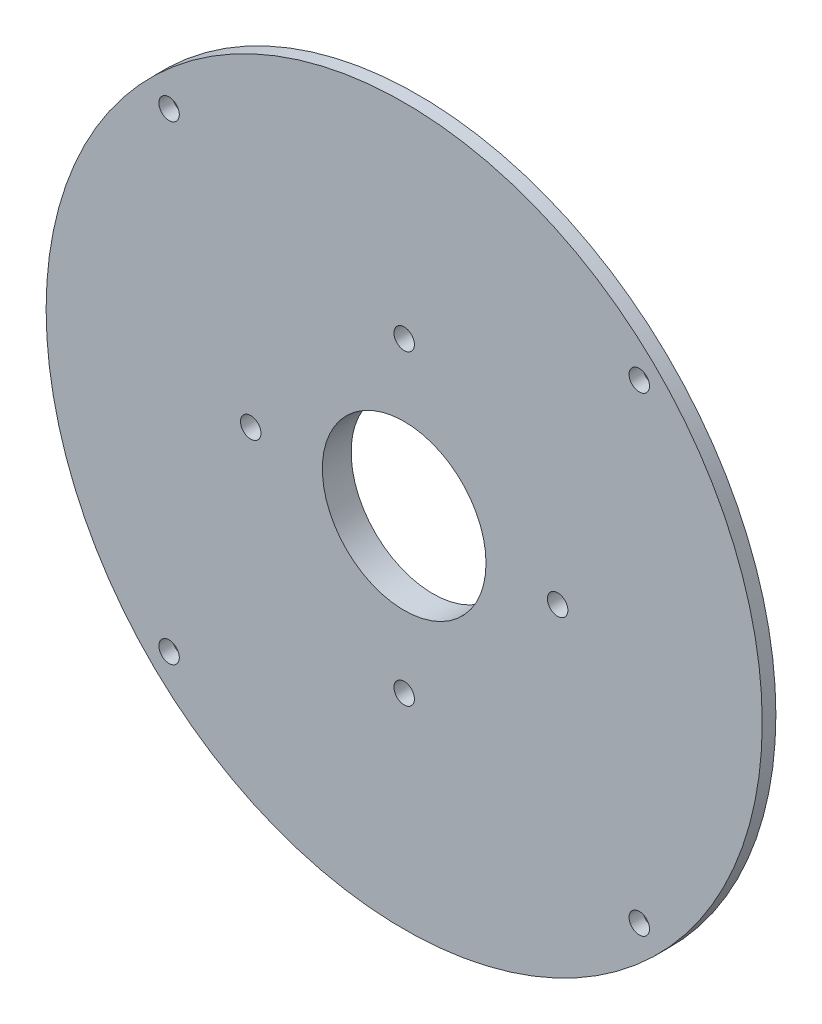
ISO-10303-21;
HEADER;
FILE_DESCRIPTION(('STEP AP214'),'2;1');
FILE_NAME('part.step','',(''),(''),'','','');
FILE_SCHEMA(('AUTOMOTIVE_DESIGN { 1 0 10303 214 1 1 1 1 }'));
ENDSEC;
DATA;
#1=APPLICATION_CONTEXT('core data for automotive mechanical design processes');
#2=APPLICATION_PROTOCOL_DEFINITION('international standard','automotive_design',2000,#1);
#3=PRODUCT_CONTEXT('',#1,'mechanical');
#4=PRODUCT('Part','Part','',(#3));
#5=PRODUCT_RELATED_PRODUCT_CATEGORY('part','',(#4));
#6=PRODUCT_DEFINITION_FORMATION('','',#4);
#7=PRODUCT_DEFINITION_CONTEXT('part definition',#1,'design');
#8=PRODUCT_DEFINITION('design','',#6,#7);
#9=PRODUCT_DEFINITION_SHAPE('','',#8);
#10=(LENGTH_UNIT() NAMED_UNIT(*) SI_UNIT(.MILLI.,.METRE.));
#11=(NAMED_UNIT(*) PLANE_ANGLE_UNIT() SI_UNIT($,.RADIAN.));
#12=(NAMED_UNIT(*) SI_UNIT($,.STERADIAN.) SOLID_ANGLE_UNIT());
#13=UNCERTAINTY_MEASURE_WITH_UNIT(LENGTH_MEASURE(1.E-05),#10,'distance_accuracy_value','');
#14=(GEOMETRIC_REPRESENTATION_CONTEXT(3) GLOBAL_UNCERTAINTY_ASSIGNED_CONTEXT((#13)) GLOBAL_UNIT_ASSIGNED_CONTEXT((#10,
#11,#12)) REPRESENTATION_CONTEXT('',''));
#15=CARTESIAN_POINT('',(0.,0.,0.));
#16=DIRECTION('',(0.,0.,1.));
#17=DIRECTION('',(1.,0.,0.));
#18=AXIS2_PLACEMENT_3D('',#15,#16,#17);
#19=CARTESIAN_POINT('',(0.,0.,-4.22));
#20=DIRECTION('',(0.,0.,1.));
#21=DIRECTION('',(1.,0.,0.));
#22=AXIS2_PLACEMENT_3D('',#19,#20,#21);
#23=CYLINDRICAL_SURFACE('',#22,30.625);
#24=CARTESIAN_POINT('',(0.,0.,-4.22));
#25=DIRECTION('',(0.,0.,1.));
#26=DIRECTION('',(1.,0.,0.));
#27=AXIS2_PLACEMENT_3D('',#24,#25,#26);
#28=CIRCLE('',#27,30.625);
#29=CARTESIAN_POINT('',(30.625,0.,-4.22));
#30=VERTEX_POINT('',#29);
#31=EDGE_CURVE('E10',#30,#30,#28,.T.);
#32=ORIENTED_EDGE('',*,*,#31,.T.);
#33=EDGE_LOOP('',(#32));
#34=FACE_BOUND('',#33,.T.);
#35=CARTESIAN_POINT('',(0.,0.,-2.));
#36=DIRECTION('',(0.,0.,1.));
#37=DIRECTION('',(1.,0.,0.));
#38=AXIS2_PLACEMENT_3D('',#35,#36,#37);
#39=CIRCLE('',#38,30.625);
#40=CARTESIAN_POINT('',(30.625,0.,-2.));
#41=VERTEX_POINT('',#40);
#42=EDGE_CURVE('E95',#41,#41,#39,.T.);
#43=ORIENTED_EDGE('',*,*,#42,.F.);
#44=EDGE_LOOP('',(#43));
#45=FACE_BOUND('',#44,.T.);
#46=ADVANCED_FACE('F37',(#34,#45),#23,.T.);
#47=CARTESIAN_POINT('',(0.,0.,-4.22));
#48=DIRECTION('',(0.,0.,1.));
#49=DIRECTION('',(1.,0.,0.));
#50=AXIS2_PLACEMENT_3D('',#47,#48,#49);
#51=CYLINDRICAL_SURFACE('',#50,12.);
#52=CARTESIAN_POINT('',(0.,0.,-4.22));
#53=DIRECTION('',(0.,0.,1.));
#54=DIRECTION('',(1.,0.,0.));
#55=AXIS2_PLACEMENT_3D('',#52,#53,#54);
#56=CIRCLE('',#55,12.);
#57=CARTESIAN_POINT('',(12.,0.,-4.22));
#58=VERTEX_POINT('',#57);
#59=EDGE_CURVE('E46',#58,#58,#56,.T.);
#60=ORIENTED_EDGE('',*,*,#59,.F.);
#61=EDGE_LOOP('',(#60));
#62=FACE_BOUND('',#61,.T.);
#63=CARTESIAN_POINT('',(0.,0.,0.));
#64=DIRECTION('',(0.,0.,1.));
#65=DIRECTION('',(1.,0.,0.));
#66=AXIS2_PLACEMENT_3D('',#63,#64,#65);
#67=CIRCLE('',#66,12.);
#68=CARTESIAN_POINT('',(12.,0.,0.));
#69=VERTEX_POINT('',#68);
#70=EDGE_CURVE('E54',#69,#69,#67,.T.);
#71=ORIENTED_EDGE('',*,*,#70,.T.);
#72=EDGE_LOOP('',(#71));
#73=FACE_BOUND('',#72,.T.);
#74=ADVANCED_FACE('F39',(#62,#73),#51,.F.);
#75=CARTESIAN_POINT('',(0.,0.,-4.22));
#76=DIRECTION('',(0.,0.,1.));
#77=DIRECTION('',(1.,0.,0.));
#78=AXIS2_PLACEMENT_3D('',#75,#76,#77);
#79=PLANE('',#78);
#80=CARTESIAN_POINT('',(0.,22.5,-4.22));
#81=DIRECTION('',(0.,0.,1.));
#82=DIRECTION('',(1.,0.,0.));
#83=AXIS2_PLACEMENT_3D('',#80,#81,#82);
#84=CIRCLE('',#83,1.5);
#85=CARTESIAN_POINT('',(1.5,22.5,-4.22));
#86=VERTEX_POINT('',#85);
#87=EDGE_CURVE('E91',#86,#86,#84,.T.);
#88=ORIENTED_EDGE('',*,*,#87,.T.);
#89=EDGE_LOOP('',(#88));
#90=FACE_BOUND('',#89,.T.);
#91=CARTESIAN_POINT('',(22.5,0.,-4.22));
#92=DIRECTION('',(0.,0.,1.));
#93=DIRECTION('',(1.,0.,0.));
#94=AXIS2_PLACEMENT_3D('',#91,#92,#93);
#95=CIRCLE('',#94,1.5);
#96=CARTESIAN_POINT('',(24.,0.,-4.22));
#97=VERTEX_POINT('',#96);
#98=EDGE_CURVE('E84',#97,#97,#95,.T.);
#99=ORIENTED_EDGE('',*,*,#98,.T.);
#100=EDGE_LOOP('',(#99));
#101=FACE_BOUND('',#100,.T.);
#102=CARTESIAN_POINT('',(0.,-22.5,-4.22));
#103=DIRECTION('',(0.,0.,1.));
#104=DIRECTION('',(1.,0.,0.));
#105=AXIS2_PLACEMENT_3D('',#102,#103,#104);
#106=CIRCLE('',#105,1.5);
#107=CARTESIAN_POINT('',(1.5,-22.5,-4.22));
#108=VERTEX_POINT('',#107);
#109=EDGE_CURVE('E78',#108,#108,#106,.T.);
#110=ORIENTED_EDGE('',*,*,#109,.T.);
#111=EDGE_LOOP('',(#110));
#112=FACE_BOUND('',#111,.T.);
#113=CARTESIAN_POINT('',(-22.5,0.,-4.22));
#114=DIRECTION('',(0.,0.,1.));
#115=DIRECTION('',(1.,0.,0.));
#116=AXIS2_PLACEMENT_3D('',#113,#114,#115);
#117=CIRCLE('',#116,1.5);
#118=CARTESIAN_POINT('',(-21.,0.,-4.22));
#119=VERTEX_POINT('',#118);
#120=EDGE_CURVE('E73',#119,#119,#117,.T.);
#121=ORIENTED_EDGE('',*,*,#120,.T.);
#122=EDGE_LOOP('',(#121));
#123=FACE_BOUND('',#122,.T.);
#124=ORIENTED_EDGE('',*,*,#59,.T.);
#125=EDGE_LOOP('',(#124));
#126=FACE_BOUND('',#125,.T.);
#127=ORIENTED_EDGE('',*,*,#31,.F.);
#128=EDGE_LOOP('',(#127));
#129=FACE_BOUND('',#128,.T.);
#130=ADVANCED_FACE('F117',(#90,#101,#112,#123,#126,#129),#79,.F.);
#131=CARTESIAN_POINT('',(0.,0.,0.));
#132=DIRECTION('',(0.,0.,1.));
#133=DIRECTION('',(1.,0.,0.));
#134=AXIS2_PLACEMENT_3D('',#131,#132,#133);
#135=PLANE('',#134);
#136=CARTESIAN_POINT('',(0.,22.5,0.));
#137=DIRECTION('',(0.,0.,1.));
#138=DIRECTION('',(1.,0.,0.));
#139=AXIS2_PLACEMENT_3D('',#136,#137,#138);
#140=CIRCLE('',#139,1.5);
#141=CARTESIAN_POINT('',(1.5,22.5,0.));
#142=VERTEX_POINT('',#141);
#143=EDGE_CURVE('E189',#142,#142,#140,.T.);
#144=ORIENTED_EDGE('',*,*,#143,.F.);
#145=EDGE_LOOP('',(#144));
#146=FACE_BOUND('',#145,.T.);
#147=CARTESIAN_POINT('',(34.4714555828442,34.4714555828442,0.));
#148=DIRECTION('',(0.,0.,1.));
#149=DIRECTION('',(1.,0.,0.));
#150=AXIS2_PLACEMENT_3D('',#147,#148,#149);
#151=CIRCLE('',#150,1.5);
#152=CARTESIAN_POINT('',(35.9714555828442,34.4714555828442,0.));
#153=VERTEX_POINT('',#152);
#154=EDGE_CURVE('E191',#153,#153,#151,.T.);
#155=ORIENTED_EDGE('',*,*,#154,.F.);
#156=EDGE_LOOP('',(#155));
#157=FACE_BOUND('',#156,.T.);
#158=CARTESIAN_POINT('',(34.4714555828442,-34.4714555828442,0.));
#159=DIRECTION('',(0.,0.,1.));
#160=DIRECTION('',(1.,0.,0.));
#161=AXIS2_PLACEMENT_3D('',#158,#159,#160);
#162=CIRCLE('',#161,1.5);
#163=CARTESIAN_POINT('',(35.9714555828442,-34.4714555828442,0.));
#164=VERTEX_POINT('',#163);
#165=EDGE_CURVE('E195',#164,#164,#162,.T.);
#166=ORIENTED_EDGE('',*,*,#165,.F.);
#167=EDGE_LOOP('',(#166));
#168=FACE_BOUND('',#167,.T.);
#169=CARTESIAN_POINT('',(-34.4714555828442,-34.4714555828442,0.));
#170=DIRECTION('',(0.,0.,1.));
#171=DIRECTION('',(1.,0.,0.));
#172=AXIS2_PLACEMENT_3D('',#169,#170,#171);
#173=CIRCLE('',#172,1.50000000000001);
#174=CARTESIAN_POINT('',(-32.9714555828442,-34.4714555828442,0.));
#175=VERTEX_POINT('',#174);
#176=EDGE_CURVE('E202',#175,#175,#173,.T.);
#177=ORIENTED_EDGE('',*,*,#176,.F.);
#178=EDGE_LOOP('',(#177));
#179=FACE_BOUND('',#178,.T.);
#180=CARTESIAN_POINT('',(22.5,0.,0.));
#181=DIRECTION('',(0.,0.,1.));
#182=DIRECTION('',(1.,0.,0.));
#183=AXIS2_PLACEMENT_3D('',#180,#181,#182);
#184=CIRCLE('',#183,1.5);
#185=CARTESIAN_POINT('',(24.,0.,0.));
#186=VERTEX_POINT('',#185);
#187=EDGE_CURVE('E204',#186,#186,#184,.T.);
#188=ORIENTED_EDGE('',*,*,#187,.F.);
#189=EDGE_LOOP('',(#188));
#190=FACE_BOUND('',#189,.T.);
#191=CARTESIAN_POINT('',(0.,-22.5,0.));
#192=DIRECTION('',(0.,0.,1.));
#193=DIRECTION('',(1.,0.,0.));
#194=AXIS2_PLACEMENT_3D('',#191,#192,#193);
#195=CIRCLE('',#194,1.5);
#196=CARTESIAN_POINT('',(1.5,-22.5,0.));
#197=VERTEX_POINT('',#196);
#198=EDGE_CURVE('E207',#197,#197,#195,.T.);
#199=ORIENTED_EDGE('',*,*,#198,.F.);
#200=EDGE_LOOP('',(#199));
#201=FACE_BOUND('',#200,.T.);
#202=CARTESIAN_POINT('',(-22.5,0.,0.));
#203=DIRECTION('',(0.,0.,1.));
#204=DIRECTION('',(1.,0.,0.));
#205=AXIS2_PLACEMENT_3D('',#202,#203,#204);
#206=CIRCLE('',#205,1.5);
#207=CARTESIAN_POINT('',(-21.,0.,0.));
#208=VERTEX_POINT('',#207);
#209=EDGE_CURVE('E198',#208,#208,#206,.T.);
#210=ORIENTED_EDGE('',*,*,#209,.F.);
#211=EDGE_LOOP('',(#210));
#212=FACE_BOUND('',#211,.T.);
#213=CARTESIAN_POINT('',(-34.4714555828442,34.4714555828442,0.));
#214=DIRECTION('',(0.,0.,1.));
#215=DIRECTION('',(1.,0.,0.));
#216=AXIS2_PLACEMENT_3D('',#213,#214,#215);
#217=CIRCLE('',#216,1.50000000000002);
#218=CARTESIAN_POINT('',(-32.9714555828442,34.4714555828442,0.));
#219=VERTEX_POINT('',#218);
#220=EDGE_CURVE('E66',#219,#219,#217,.T.);
#221=ORIENTED_EDGE('',*,*,#220,.F.);
#222=EDGE_LOOP('',(#221));
#223=FACE_BOUND('',#222,.T.);
#224=ORIENTED_EDGE('',*,*,#70,.F.);
#225=EDGE_LOOP('',(#224));
#226=FACE_BOUND('',#225,.T.);
#227=CARTESIAN_POINT('',(0.,0.,0.));
#228=DIRECTION('',(0.,0.,1.));
#229=DIRECTION('',(1.,0.,0.));
#230=AXIS2_PLACEMENT_3D('',#227,#228,#229);
#231=CIRCLE('',#230,52.5);
#232=CARTESIAN_POINT('',(52.5,0.,0.));
#233=VERTEX_POINT('',#232);
#234=EDGE_CURVE('E94',#233,#233,#231,.T.);
#235=ORIENTED_EDGE('',*,*,#234,.T.);
#236=EDGE_LOOP('',(#235));
#237=FACE_BOUND('',#236,.T.);
#238=ADVANCED_FACE('F104',(#146,#157,#168,#179,#190,#201,#212,#223,#226,#237),#135,.T.);
#239=CARTESIAN_POINT('',(0.,0.,-2.));
#240=DIRECTION('',(0.,0.,1.));
#241=DIRECTION('',(1.,0.,0.));
#242=AXIS2_PLACEMENT_3D('',#239,#240,#241);
#243=CYLINDRICAL_SURFACE('',#242,52.5);
#244=CARTESIAN_POINT('',(0.,0.,-2.));
#245=DIRECTION('',(0.,0.,1.));
#246=DIRECTION('',(1.,0.,0.));
#247=AXIS2_PLACEMENT_3D('',#244,#245,#246);
#248=CIRCLE('',#247,52.5);
#249=CARTESIAN_POINT('',(52.5,0.,-2.));
#250=VERTEX_POINT('',#249);
#251=EDGE_CURVE('E61',#250,#250,#248,.T.);
#252=ORIENTED_EDGE('',*,*,#251,.T.);
#253=EDGE_LOOP('',(#252));
#254=FACE_BOUND('',#253,.T.);
#255=ORIENTED_EDGE('',*,*,#234,.F.);
#256=EDGE_LOOP('',(#255));
#257=FACE_BOUND('',#256,.T.);
#258=ADVANCED_FACE('F106',(#254,#257),#243,.T.);
#259=CARTESIAN_POINT('',(0.,0.,-2.));
#260=DIRECTION('',(0.,0.,1.));
#261=DIRECTION('',(1.,0.,0.));
#262=AXIS2_PLACEMENT_3D('',#259,#260,#261);
#263=PLANE('',#262);
#264=CARTESIAN_POINT('',(34.4714555828442,34.4714555828442,-2.));
#265=DIRECTION('',(0.,0.,1.));
#266=DIRECTION('',(1.,0.,0.));
#267=AXIS2_PLACEMENT_3D('',#264,#265,#266);
#268=CIRCLE('',#267,1.5);
#269=CARTESIAN_POINT('',(35.9714555828442,34.4714555828442,-2.));
#270=VERTEX_POINT('',#269);
#271=EDGE_CURVE('E41',#270,#270,#268,.T.);
#272=ORIENTED_EDGE('',*,*,#271,.T.);
#273=EDGE_LOOP('',(#272));
#274=FACE_BOUND('',#273,.T.);
#275=CARTESIAN_POINT('',(34.4714555828442,-34.4714555828442,-2.));
#276=DIRECTION('',(0.,0.,1.));
#277=DIRECTION('',(1.,0.,0.));
#278=AXIS2_PLACEMENT_3D('',#275,#276,#277);
#279=CIRCLE('',#278,1.5);
#280=CARTESIAN_POINT('',(35.9714555828442,-34.4714555828442,-2.));
#281=VERTEX_POINT('',#280);
#282=EDGE_CURVE('E68',#281,#281,#279,.T.);
#283=ORIENTED_EDGE('',*,*,#282,.T.);
#284=EDGE_LOOP('',(#283));
#285=FACE_BOUND('',#284,.T.);
#286=CARTESIAN_POINT('',(-34.4714555828442,-34.4714555828442,-2.));
#287=DIRECTION('',(0.,0.,1.));
#288=DIRECTION('',(1.,0.,0.));
#289=AXIS2_PLACEMENT_3D('',#286,#287,#288);
#290=CIRCLE('',#289,1.50000000000001);
#291=CARTESIAN_POINT('',(-32.9714555828442,-34.4714555828442,-2.));
#292=VERTEX_POINT('',#291);
#293=EDGE_CURVE('E65',#292,#292,#290,.T.);
#294=ORIENTED_EDGE('',*,*,#293,.T.);
#295=EDGE_LOOP('',(#294));
#296=FACE_BOUND('',#295,.T.);
#297=CARTESIAN_POINT('',(-34.4714555828442,34.4714555828442,-2.));
#298=DIRECTION('',(0.,0.,1.));
#299=DIRECTION('',(1.,0.,0.));
#300=AXIS2_PLACEMENT_3D('',#297,#298,#299);
#301=CIRCLE('',#300,1.50000000000002);
#302=CARTESIAN_POINT('',(-32.9714555828442,34.4714555828442,-2.));
#303=VERTEX_POINT('',#302);
#304=EDGE_CURVE('E62',#303,#303,#301,.T.);
#305=ORIENTED_EDGE('',*,*,#304,.T.);
#306=EDGE_LOOP('',(#305));
#307=FACE_BOUND('',#306,.T.);
#308=ORIENTED_EDGE('',*,*,#42,.T.);
#309=EDGE_LOOP('',(#308));
#310=FACE_BOUND('',#309,.T.);
#311=ORIENTED_EDGE('',*,*,#251,.F.);
#312=EDGE_LOOP('',(#311));
#313=FACE_BOUND('',#312,.T.);
#314=ADVANCED_FACE('F108',(#274,#285,#296,#307,#310,#313),#263,.F.);
#315=CARTESIAN_POINT('',(-34.4714555828442,34.4714555828442,-20.));
#316=DIRECTION('',(0.,0.,1.));
#317=DIRECTION('',(1.,0.,0.));
#318=AXIS2_PLACEMENT_3D('',#315,#316,#317);
#319=CYLINDRICAL_SURFACE('',#318,1.50000000000002);
#320=ORIENTED_EDGE('',*,*,#220,.T.);
#321=EDGE_LOOP('',(#320));
#322=FACE_BOUND('',#321,.T.);
#323=ORIENTED_EDGE('',*,*,#304,.F.);
#324=EDGE_LOOP('',(#323));
#325=FACE_BOUND('',#324,.T.);
#326=ADVANCED_FACE('F115',(#322,#325),#319,.F.);
#327=CARTESIAN_POINT('',(-34.4714555828442,-34.4714555828442,-20.));
#328=DIRECTION('',(0.,0.,1.));
#329=DIRECTION('',(1.,0.,0.));
#330=AXIS2_PLACEMENT_3D('',#327,#328,#329);
#331=CYLINDRICAL_SURFACE('',#330,1.50000000000001);
#332=ORIENTED_EDGE('',*,*,#176,.T.);
#333=EDGE_LOOP('',(#332));
#334=FACE_BOUND('',#333,.T.);
#335=ORIENTED_EDGE('',*,*,#293,.F.);
#336=EDGE_LOOP('',(#335));
#337=FACE_BOUND('',#336,.T.);
#338=ADVANCED_FACE('F170',(#334,#337),#331,.F.);
#339=CARTESIAN_POINT('',(34.4714555828442,-34.4714555828442,-20.));
#340=DIRECTION('',(0.,0.,1.));
#341=DIRECTION('',(1.,0.,0.));
#342=AXIS2_PLACEMENT_3D('',#339,#340,#341);
#343=CYLINDRICAL_SURFACE('',#342,1.5);
#344=ORIENTED_EDGE('',*,*,#165,.T.);
#345=EDGE_LOOP('',(#344));
#346=FACE_BOUND('',#345,.T.);
#347=ORIENTED_EDGE('',*,*,#282,.F.);
#348=EDGE_LOOP('',(#347));
#349=FACE_BOUND('',#348,.T.);
#350=ADVANCED_FACE('F166',(#346,#349),#343,.F.);
#351=CARTESIAN_POINT('',(34.4714555828442,34.4714555828442,-20.));
#352=DIRECTION('',(0.,0.,1.));
#353=DIRECTION('',(1.,0.,0.));
#354=AXIS2_PLACEMENT_3D('',#351,#352,#353);
#355=CYLINDRICAL_SURFACE('',#354,1.5);
#356=ORIENTED_EDGE('',*,*,#154,.T.);
#357=EDGE_LOOP('',(#356));
#358=FACE_BOUND('',#357,.T.);
#359=ORIENTED_EDGE('',*,*,#271,.F.);
#360=EDGE_LOOP('',(#359));
#361=FACE_BOUND('',#360,.T.);
#362=ADVANCED_FACE('F156',(#358,#361),#355,.F.);
#363=CARTESIAN_POINT('',(-22.5,0.,-20.));
#364=DIRECTION('',(0.,0.,1.));
#365=DIRECTION('',(1.,0.,0.));
#366=AXIS2_PLACEMENT_3D('',#363,#364,#365);
#367=CYLINDRICAL_SURFACE('',#366,1.5);
#368=ORIENTED_EDGE('',*,*,#209,.T.);
#369=EDGE_LOOP('',(#368));
#370=FACE_BOUND('',#369,.T.);
#371=ORIENTED_EDGE('',*,*,#120,.F.);
#372=EDGE_LOOP('',(#371));
#373=FACE_BOUND('',#372,.T.);
#374=ADVANCED_FACE('F146',(#370,#373),#367,.F.);
#375=CARTESIAN_POINT('',(0.,-22.5,-20.));
#376=DIRECTION('',(0.,0.,1.));
#377=DIRECTION('',(1.,0.,0.));
#378=AXIS2_PLACEMENT_3D('',#375,#376,#377);
#379=CYLINDRICAL_SURFACE('',#378,1.5);
#380=ORIENTED_EDGE('',*,*,#198,.T.);
#381=EDGE_LOOP('',(#380));
#382=FACE_BOUND('',#381,.T.);
#383=ORIENTED_EDGE('',*,*,#109,.F.);
#384=EDGE_LOOP('',(#383));
#385=FACE_BOUND('',#384,.T.);
#386=ADVANCED_FACE('F143',(#382,#385),#379,.F.);
#387=CARTESIAN_POINT('',(22.5,0.,-20.));
#388=DIRECTION('',(0.,0.,1.));
#389=DIRECTION('',(1.,0.,0.));
#390=AXIS2_PLACEMENT_3D('',#387,#388,#389);
#391=CYLINDRICAL_SURFACE('',#390,1.5);
#392=ORIENTED_EDGE('',*,*,#187,.T.);
#393=EDGE_LOOP('',(#392));
#394=FACE_BOUND('',#393,.T.);
#395=ORIENTED_EDGE('',*,*,#98,.F.);
#396=EDGE_LOOP('',(#395));
#397=FACE_BOUND('',#396,.T.);
#398=ADVANCED_FACE('F145',(#394,#397),#391,.F.);
#399=CARTESIAN_POINT('',(0.,22.5,-20.));
#400=DIRECTION('',(0.,0.,1.));
#401=DIRECTION('',(1.,0.,0.));
#402=AXIS2_PLACEMENT_3D('',#399,#400,#401);
#403=CYLINDRICAL_SURFACE('',#402,1.5);
#404=ORIENTED_EDGE('',*,*,#143,.T.);
#405=EDGE_LOOP('',(#404));
#406=FACE_BOUND('',#405,.T.);
#407=ORIENTED_EDGE('',*,*,#87,.F.);
#408=EDGE_LOOP('',(#407));
#409=FACE_BOUND('',#408,.T.);
#410=ADVANCED_FACE('F153',(#406,#409),#403,.F.);
#411=CLOSED_SHELL('',(#46,#74,#130,#238,#258,#314,#326,#338,#350,#362,#374,#386,#398,#410));
#412=MANIFOLD_SOLID_BREP('B2',#411);
#413=ADVANCED_BREP_SHAPE_REPRESENTATION('',(#18,#412),#14);
#414=SHAPE_DEFINITION_REPRESENTATION(#9,#413);
ENDSEC;
END-ISO-10303-21;
